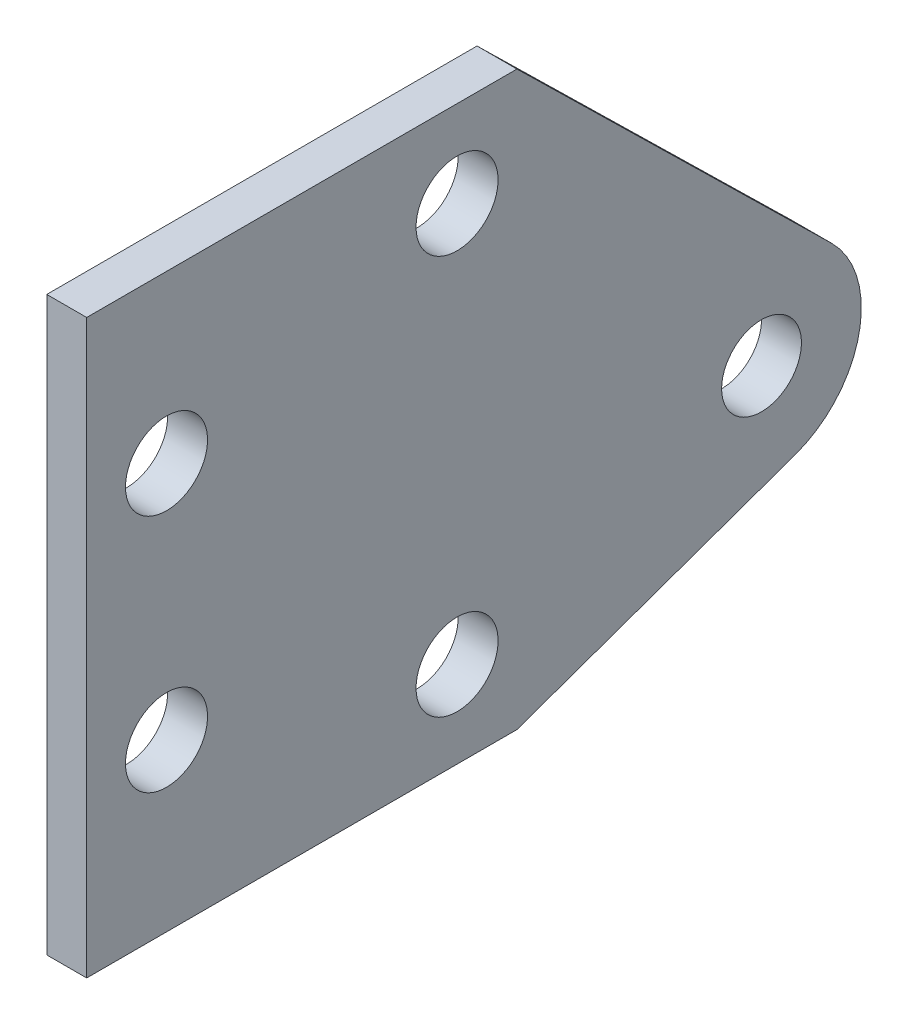
ISO-10303-21;
HEADER;
FILE_DESCRIPTION(('STEP AP214'),'2;1');
FILE_NAME('part.step','',(''),(''),'','','');
FILE_SCHEMA(('AUTOMOTIVE_DESIGN { 1 0 10303 214 1 1 1 1 }'));
ENDSEC;
DATA;
#1=APPLICATION_CONTEXT('core data for automotive mechanical design processes');
#2=APPLICATION_PROTOCOL_DEFINITION('international standard','automotive_design',2000,#1);
#3=PRODUCT_CONTEXT('',#1,'mechanical');
#4=PRODUCT('Part','Part','',(#3));
#5=PRODUCT_RELATED_PRODUCT_CATEGORY('part','',(#4));
#6=PRODUCT_DEFINITION_FORMATION('','',#4);
#7=PRODUCT_DEFINITION_CONTEXT('part definition',#1,'design');
#8=PRODUCT_DEFINITION('design','',#6,#7);
#9=PRODUCT_DEFINITION_SHAPE('','',#8);
#10=(LENGTH_UNIT() NAMED_UNIT(*) SI_UNIT(.MILLI.,.METRE.));
#11=(NAMED_UNIT(*) PLANE_ANGLE_UNIT() SI_UNIT($,.RADIAN.));
#12=(NAMED_UNIT(*) SI_UNIT($,.STERADIAN.) SOLID_ANGLE_UNIT());
#13=UNCERTAINTY_MEASURE_WITH_UNIT(LENGTH_MEASURE(1.E-05),#10,'distance_accuracy_value','');
#14=(GEOMETRIC_REPRESENTATION_CONTEXT(3) GLOBAL_UNCERTAINTY_ASSIGNED_CONTEXT((#13)) GLOBAL_UNIT_ASSIGNED_CONTEXT((#10,
#11,#12)) REPRESENTATION_CONTEXT('',''));
#15=CARTESIAN_POINT('',(0.,0.,0.));
#16=DIRECTION('',(0.,0.,1.));
#17=DIRECTION('',(1.,0.,0.));
#18=AXIS2_PLACEMENT_3D('',#15,#16,#17);
#19=CARTESIAN_POINT('',(-28.5750000000038,268.493082500583,95.4248000965209));
#20=DIRECTION('',(0.,0.942258335635861,0.334886889747475));
#21=DIRECTION('',(0.,-0.334886889747475,0.942258335635861));
#22=AXIS2_PLACEMENT_3D('',#19,#20,#21);
#23=PLANE('',#22);
#24=DIRECTION('',(0.,-0.334886889747475,0.942258335635861));
#25=VECTOR('',#24,1.);
#26=CARTESIAN_POINT('',(-25.4000000000038,268.493082500583,95.4248000965209));
#27=LINE('',#26,#25);
#28=CARTESIAN_POINT('',(-25.4000000000038,341.719008080164,-110.608164687619));
#29=VERTEX_POINT('',#28);
#30=CARTESIAN_POINT('',(-25.4000000000038,333.860683619272,-88.497500000243));
#31=VERTEX_POINT('',#30);
#32=EDGE_CURVE('E136',#29,#31,#27,.T.);
#33=ORIENTED_EDGE('',*,*,#32,.T.);
#34=DIRECTION('',(1.,0.,0.));
#35=VECTOR('',#34,1.);
#36=CARTESIAN_POINT('',(-28.5750000000038,333.860683619272,-88.497500000243));
#37=LINE('',#36,#35);
#38=CARTESIAN_POINT('',(-28.5750000000038,333.860683619272,-88.497500000243));
#39=VERTEX_POINT('',#38);
#40=EDGE_CURVE('E11',#39,#31,#37,.T.);
#41=ORIENTED_EDGE('',*,*,#40,.F.);
#42=DIRECTION('',(0.,-0.334886889747475,0.942258335635861));
#43=VECTOR('',#42,1.);
#44=CARTESIAN_POINT('',(-28.5750000000038,268.493082500583,95.4248000965209));
#45=LINE('',#44,#43);
#46=CARTESIAN_POINT('',(-28.5750000000038,341.719008080164,-110.608164687619));
#47=VERTEX_POINT('',#46);
#48=EDGE_CURVE('E161',#47,#39,#45,.T.);
#49=ORIENTED_EDGE('',*,*,#48,.F.);
#50=DIRECTION('',(1.,0.,0.));
#51=VECTOR('',#50,1.);
#52=CARTESIAN_POINT('',(-28.5750000000038,341.719008080164,-110.608164687619));
#53=LINE('',#52,#51);
#54=EDGE_CURVE('E135',#47,#29,#53,.T.);
#55=ORIENTED_EDGE('',*,*,#54,.T.);
#56=EDGE_LOOP('',(#33,#41,#49,#55));
#57=FACE_BOUND('',#56,.T.);
#58=ADVANCED_FACE('F36',(#57),#23,.F.);
#59=CARTESIAN_POINT('',(-28.5750000000038,333.860683619272,0.));
#60=DIRECTION('',(0.,1.,0.));
#61=DIRECTION('',(0.,0.,1.));
#62=AXIS2_PLACEMENT_3D('',#59,#60,#61);
#63=PLANE('',#62);
#64=DIRECTION('',(0.,0.,1.));
#65=VECTOR('',#64,1.);
#66=CARTESIAN_POINT('',(-25.4000000000038,333.860683619272,0.));
#67=LINE('',#66,#65);
#68=CARTESIAN_POINT('',(-25.4000000000038,333.860683619272,-54.2750000002463));
#69=VERTEX_POINT('',#68);
#70=EDGE_CURVE('E139',#31,#69,#67,.T.);
#71=ORIENTED_EDGE('',*,*,#70,.T.);
#72=DIRECTION('',(1.,0.,0.));
#73=VECTOR('',#72,1.);
#74=CARTESIAN_POINT('',(-28.5750000000038,333.860683619272,-54.2750000002463));
#75=LINE('',#74,#73);
#76=CARTESIAN_POINT('',(-28.5750000000038,333.860683619272,-54.2750000002463));
#77=VERTEX_POINT('',#76);
#78=EDGE_CURVE('E44',#77,#69,#75,.T.);
#79=ORIENTED_EDGE('',*,*,#78,.F.);
#80=DIRECTION('',(0.,0.,1.));
#81=VECTOR('',#80,1.);
#82=CARTESIAN_POINT('',(-28.5750000000038,333.860683619272,0.));
#83=LINE('',#82,#81);
#84=EDGE_CURVE('E89',#39,#77,#83,.T.);
#85=ORIENTED_EDGE('',*,*,#84,.F.);
#86=ORIENTED_EDGE('',*,*,#40,.T.);
#87=EDGE_LOOP('',(#71,#79,#85,#86));
#88=FACE_BOUND('',#87,.T.);
#89=ADVANCED_FACE('F191',(#88),#63,.F.);
#90=CARTESIAN_POINT('',(-28.5750000000038,5.6850044899975E-13,-54.2750000002498));
#91=DIRECTION('',(0.,0.,-1.));
#92=DIRECTION('',(0.,1.,0.));
#93=AXIS2_PLACEMENT_3D('',#90,#91,#92);
#94=PLANE('',#93);
#95=DIRECTION('',(0.,1.,0.));
#96=VECTOR('',#95,1.);
#97=CARTESIAN_POINT('',(-25.4000000000038,5.6850044899975E-13,-54.2750000002498));
#98=LINE('',#97,#96);
#99=CARTESIAN_POINT('',(-25.4000000000038,379.360683619273,-54.2750000002459));
#100=VERTEX_POINT('',#99);
#101=EDGE_CURVE('E141',#69,#100,#98,.T.);
#102=ORIENTED_EDGE('',*,*,#101,.T.);
#103=DIRECTION('',(1.,0.,0.));
#104=VECTOR('',#103,1.);
#105=CARTESIAN_POINT('',(-28.5750000000038,379.360683619273,-54.2750000002459));
#106=LINE('',#105,#104);
#107=CARTESIAN_POINT('',(-28.5750000000038,379.360683619273,-54.2750000002459));
#108=VERTEX_POINT('',#107);
#109=EDGE_CURVE('E112',#108,#100,#106,.T.);
#110=ORIENTED_EDGE('',*,*,#109,.F.);
#111=DIRECTION('',(0.,1.,0.));
#112=VECTOR('',#111,1.);
#113=CARTESIAN_POINT('',(-28.5750000000038,5.6850044899975E-13,-54.2750000002498));
#114=LINE('',#113,#112);
#115=EDGE_CURVE('E103',#77,#108,#114,.T.);
#116=ORIENTED_EDGE('',*,*,#115,.F.);
#117=ORIENTED_EDGE('',*,*,#78,.T.);
#118=EDGE_LOOP('',(#102,#110,#116,#117));
#119=FACE_BOUND('',#118,.T.);
#120=ADVANCED_FACE('F167',(#119),#94,.F.);
#121=CARTESIAN_POINT('',(-28.5750000000038,379.360683619272,4.1755525753253E-12));
#122=DIRECTION('',(0.,-1.,0.));
#123=DIRECTION('',(0.,0.,-1.));
#124=AXIS2_PLACEMENT_3D('',#121,#122,#123);
#125=PLANE('',#124);
#126=DIRECTION('',(0.,0.,-1.));
#127=VECTOR('',#126,1.);
#128=CARTESIAN_POINT('',(-25.4000000000038,379.360683619272,4.1755525753253E-12));
#129=LINE('',#128,#127);
#130=CARTESIAN_POINT('',(-25.4000000000038,379.360683619273,-88.4975000002426));
#131=VERTEX_POINT('',#130);
#132=EDGE_CURVE('E111',#100,#131,#129,.T.);
#133=ORIENTED_EDGE('',*,*,#132,.T.);
#134=DIRECTION('',(1.,0.,0.));
#135=VECTOR('',#134,1.);
#136=CARTESIAN_POINT('',(-28.5750000000038,379.360683619273,-88.4975000002426));
#137=LINE('',#136,#135);
#138=CARTESIAN_POINT('',(-28.5750000000038,379.360683619273,-88.4975000002426));
#139=VERTEX_POINT('',#138);
#140=EDGE_CURVE('E108',#139,#131,#137,.T.);
#141=ORIENTED_EDGE('',*,*,#140,.F.);
#142=DIRECTION('',(0.,0.,-1.));
#143=VECTOR('',#142,1.);
#144=CARTESIAN_POINT('',(-28.5750000000038,379.360683619272,4.1755525753253E-12));
#145=LINE('',#144,#143);
#146=EDGE_CURVE('E96',#108,#139,#145,.T.);
#147=ORIENTED_EDGE('',*,*,#146,.F.);
#148=ORIENTED_EDGE('',*,*,#109,.T.);
#149=EDGE_LOOP('',(#133,#141,#147,#148));
#150=FACE_BOUND('',#149,.T.);
#151=ADVANCED_FACE('F109',(#150),#125,.F.);
#152=CARTESIAN_POINT('',(-28.5750000000038,237.863920821237,-232.967924063665));
#153=DIRECTION('',(0.,-0.714421084351475,0.699716023994065));
#154=DIRECTION('',(0.,-0.699716023994065,-0.714421084351475));
#155=AXIS2_PLACEMENT_3D('',#152,#153,#154);
#156=PLANE('',#155);
#157=DIRECTION('',(0.,-0.699716023994065,-0.714421084351475));
#158=VECTOR('',#157,1.);
#159=CARTESIAN_POINT('',(-25.4000000000038,237.863920821237,-232.967924063665));
#160=LINE('',#159,#158);
#161=CARTESIAN_POINT('',(-25.4000000000038,354.868900976314,-113.503995940701));
#162=VERTEX_POINT('',#161);
#163=EDGE_CURVE('E75',#131,#162,#160,.T.);
#164=ORIENTED_EDGE('',*,*,#163,.T.);
#165=DIRECTION('',(1.,0.,0.));
#166=VECTOR('',#165,1.);
#167=CARTESIAN_POINT('',(-28.5750000000038,354.868900976314,-113.503995940701));
#168=LINE('',#167,#166);
#169=CARTESIAN_POINT('',(-28.5750000000038,354.868900976314,-113.503995940701));
#170=VERTEX_POINT('',#169);
#171=EDGE_CURVE('E113',#170,#162,#168,.T.);
#172=ORIENTED_EDGE('',*,*,#171,.F.);
#173=DIRECTION('',(0.,-0.699716023994065,-0.714421084351475));
#174=VECTOR('',#173,1.);
#175=CARTESIAN_POINT('',(-28.5750000000038,237.863920821237,-232.967924063665));
#176=LINE('',#175,#174);
#177=EDGE_CURVE('E101',#139,#170,#176,.T.);
#178=ORIENTED_EDGE('',*,*,#177,.F.);
#179=ORIENTED_EDGE('',*,*,#140,.T.);
#180=EDGE_LOOP('',(#164,#172,#178,#179));
#181=FACE_BOUND('',#180,.T.);
#182=ADVANCED_FACE('F115',(#181),#156,.F.);
#183=CARTESIAN_POINT('',(-28.5750000000038,372.485683619273,-83.7350000002471));
#184=DIRECTION('',(1.,0.,0.));
#185=DIRECTION('',(0.,0.,-1.));
#186=AXIS2_PLACEMENT_3D('',#183,#184,#185);
#187=CYLINDRICAL_SURFACE('',#186,3.26390000015049);
#188=CARTESIAN_POINT('',(-28.5750000000038,372.485683619273,-83.7350000002471));
#189=DIRECTION('',(-1.,0.,0.));
#190=DIRECTION('',(0.,0.,1.));
#191=AXIS2_PLACEMENT_3D('',#188,#189,#190);
#192=CIRCLE('',#191,3.26390000015049);
#193=CARTESIAN_POINT('',(-28.5750000000038,372.485683619273,-80.4711000000966));
#194=VERTEX_POINT('',#193);
#195=EDGE_CURVE('E129',#194,#194,#192,.F.);
#196=ORIENTED_EDGE('',*,*,#195,.F.);
#197=EDGE_LOOP('',(#196));
#198=FACE_BOUND('',#197,.T.);
#199=CARTESIAN_POINT('',(-25.4000000000038,372.485683619273,-83.7350000002471));
#200=DIRECTION('',(-1.,0.,0.));
#201=DIRECTION('',(0.,0.,1.));
#202=AXIS2_PLACEMENT_3D('',#199,#200,#201);
#203=CIRCLE('',#202,3.26390000015049);
#204=CARTESIAN_POINT('',(-25.4000000000038,372.485683619273,-80.4711000000966));
#205=VERTEX_POINT('',#204);
#206=EDGE_CURVE('E155',#205,#205,#203,.F.);
#207=ORIENTED_EDGE('',*,*,#206,.T.);
#208=EDGE_LOOP('',(#207));
#209=FACE_BOUND('',#208,.T.);
#210=ADVANCED_FACE('F202',(#198,#209),#187,.F.);
#211=CARTESIAN_POINT('',(-28.5750000000038,366.135683619273,-60.6250000002459));
#212=DIRECTION('',(1.,0.,0.));
#213=DIRECTION('',(0.,0.,-1.));
#214=AXIS2_PLACEMENT_3D('',#211,#212,#213);
#215=CYLINDRICAL_SURFACE('',#214,3.26390000000004);
#216=CARTESIAN_POINT('',(-28.5750000000038,366.135683619273,-60.6250000002459));
#217=DIRECTION('',(-1.,0.,0.));
#218=DIRECTION('',(0.,0.,1.));
#219=AXIS2_PLACEMENT_3D('',#216,#217,#218);
#220=CIRCLE('',#219,3.26390000000004);
#221=CARTESIAN_POINT('',(-28.5750000000038,366.135683619273,-57.3611000002458));
#222=VERTEX_POINT('',#221);
#223=EDGE_CURVE('E126',#222,#222,#220,.F.);
#224=ORIENTED_EDGE('',*,*,#223,.F.);
#225=EDGE_LOOP('',(#224));
#226=FACE_BOUND('',#225,.T.);
#227=CARTESIAN_POINT('',(-25.4000000000038,366.135683619273,-60.6250000002459));
#228=DIRECTION('',(-1.,0.,0.));
#229=DIRECTION('',(0.,0.,1.));
#230=AXIS2_PLACEMENT_3D('',#227,#228,#229);
#231=CIRCLE('',#230,3.26390000000004);
#232=CARTESIAN_POINT('',(-25.4000000000038,366.135683619273,-57.3611000002458));
#233=VERTEX_POINT('',#232);
#234=EDGE_CURVE('E152',#233,#233,#231,.F.);
#235=ORIENTED_EDGE('',*,*,#234,.T.);
#236=EDGE_LOOP('',(#235));
#237=FACE_BOUND('',#236,.T.);
#238=ADVANCED_FACE('F206',(#226,#237),#215,.F.);
#239=CARTESIAN_POINT('',(-28.5750000000038,340.735683619273,-83.7350000002471));
#240=DIRECTION('',(1.,0.,0.));
#241=DIRECTION('',(0.,0.,-1.));
#242=AXIS2_PLACEMENT_3D('',#239,#240,#241);
#243=CYLINDRICAL_SURFACE('',#242,3.26390000015049);
#244=CARTESIAN_POINT('',(-28.5750000000038,340.735683619273,-83.7350000002471));
#245=DIRECTION('',(-1.,0.,0.));
#246=DIRECTION('',(0.,0.,1.));
#247=AXIS2_PLACEMENT_3D('',#244,#245,#246);
#248=CIRCLE('',#247,3.26390000015049);
#249=CARTESIAN_POINT('',(-28.5750000000038,340.735683619273,-80.4711000000966));
#250=VERTEX_POINT('',#249);
#251=EDGE_CURVE('E123',#250,#250,#248,.F.);
#252=ORIENTED_EDGE('',*,*,#251,.F.);
#253=EDGE_LOOP('',(#252));
#254=FACE_BOUND('',#253,.T.);
#255=CARTESIAN_POINT('',(-25.4000000000038,340.735683619273,-83.7350000002471));
#256=DIRECTION('',(-1.,0.,0.));
#257=DIRECTION('',(0.,0.,1.));
#258=AXIS2_PLACEMENT_3D('',#255,#256,#257);
#259=CIRCLE('',#258,3.26390000015049);
#260=CARTESIAN_POINT('',(-25.4000000000038,340.735683619273,-80.4711000000966));
#261=VERTEX_POINT('',#260);
#262=EDGE_CURVE('E149',#261,#261,#259,.F.);
#263=ORIENTED_EDGE('',*,*,#262,.T.);
#264=EDGE_LOOP('',(#263));
#265=FACE_BOUND('',#264,.T.);
#266=ADVANCED_FACE('F186',(#254,#265),#243,.F.);
#267=CARTESIAN_POINT('',(-28.5750000000038,349.198183619274,-107.950000000248));
#268=DIRECTION('',(1.,0.,0.));
#269=DIRECTION('',(0.,0.,-1.));
#270=AXIS2_PLACEMENT_3D('',#267,#268,#269);
#271=CYLINDRICAL_SURFACE('',#270,3.175);
#272=CARTESIAN_POINT('',(-28.5750000000038,349.198183619274,-107.950000000248));
#273=DIRECTION('',(-1.,0.,0.));
#274=DIRECTION('',(0.,0.,1.));
#275=AXIS2_PLACEMENT_3D('',#272,#273,#274);
#276=CIRCLE('',#275,3.175);
#277=CARTESIAN_POINT('',(-28.5750000000038,349.198183619274,-104.775000000248));
#278=VERTEX_POINT('',#277);
#279=EDGE_CURVE('E117',#278,#278,#276,.T.);
#280=ORIENTED_EDGE('',*,*,#279,.T.);
#281=EDGE_LOOP('',(#280));
#282=FACE_BOUND('',#281,.T.);
#283=CARTESIAN_POINT('',(-25.4000000000038,349.198183619274,-107.950000000248));
#284=DIRECTION('',(-1.,0.,0.));
#285=DIRECTION('',(0.,0.,1.));
#286=AXIS2_PLACEMENT_3D('',#283,#284,#285);
#287=CIRCLE('',#286,3.175);
#288=CARTESIAN_POINT('',(-25.4000000000038,349.198183619274,-104.775000000248));
#289=VERTEX_POINT('',#288);
#290=EDGE_CURVE('E146',#289,#289,#287,.T.);
#291=ORIENTED_EDGE('',*,*,#290,.F.);
#292=EDGE_LOOP('',(#291));
#293=FACE_BOUND('',#292,.T.);
#294=ADVANCED_FACE('F178',(#282,#293),#271,.F.);
#295=CARTESIAN_POINT('',(-28.5750000000038,349.198183619274,-107.950000000248));
#296=DIRECTION('',(1.,0.,0.));
#297=DIRECTION('',(0.,0.,-1.));
#298=AXIS2_PLACEMENT_3D('',#295,#296,#297);
#299=CYLINDRICAL_SURFACE('',#298,7.9375);
#300=CARTESIAN_POINT('',(-25.4000000000038,349.198183619274,-107.950000000248));
#301=DIRECTION('',(-1.,0.,0.));
#302=DIRECTION('',(0.,0.,1.));
#303=AXIS2_PLACEMENT_3D('',#300,#301,#302);
#304=CIRCLE('',#303,7.9375);
#305=EDGE_CURVE('E81',#162,#29,#304,.T.);
#306=ORIENTED_EDGE('',*,*,#305,.T.);
#307=ORIENTED_EDGE('',*,*,#54,.F.);
#308=CARTESIAN_POINT('',(-28.5750000000038,349.198183619274,-107.950000000248));
#309=DIRECTION('',(-1.,0.,0.));
#310=DIRECTION('',(0.,0.,1.));
#311=AXIS2_PLACEMENT_3D('',#308,#309,#310);
#312=CIRCLE('',#311,7.9375);
#313=EDGE_CURVE('E52',#170,#47,#312,.T.);
#314=ORIENTED_EDGE('',*,*,#313,.F.);
#315=ORIENTED_EDGE('',*,*,#171,.T.);
#316=EDGE_LOOP('',(#306,#307,#314,#315));
#317=FACE_BOUND('',#316,.T.);
#318=ADVANCED_FACE('F175',(#317),#299,.T.);
#319=CARTESIAN_POINT('',(-28.5750000000038,347.085683619273,-60.6250000002459));
#320=DIRECTION('',(1.,0.,0.));
#321=DIRECTION('',(0.,0.,-1.));
#322=AXIS2_PLACEMENT_3D('',#319,#320,#321);
#323=CYLINDRICAL_SURFACE('',#322,3.26390000000003);
#324=CARTESIAN_POINT('',(-28.5750000000038,347.085683619273,-60.6250000002459));
#325=DIRECTION('',(-1.,0.,0.));
#326=DIRECTION('',(0.,0.,1.));
#327=AXIS2_PLACEMENT_3D('',#324,#325,#326);
#328=CIRCLE('',#327,3.26390000000003);
#329=CARTESIAN_POINT('',(-28.5750000000038,347.085683619273,-57.3611000002458));
#330=VERTEX_POINT('',#329);
#331=EDGE_CURVE('E132',#330,#330,#328,.F.);
#332=ORIENTED_EDGE('',*,*,#331,.F.);
#333=EDGE_LOOP('',(#332));
#334=FACE_BOUND('',#333,.T.);
#335=CARTESIAN_POINT('',(-25.4000000000038,347.085683619273,-60.6250000002459));
#336=DIRECTION('',(-1.,0.,0.));
#337=DIRECTION('',(0.,0.,1.));
#338=AXIS2_PLACEMENT_3D('',#335,#336,#337);
#339=CIRCLE('',#338,3.26390000000003);
#340=CARTESIAN_POINT('',(-25.4000000000038,347.085683619273,-57.3611000002458));
#341=VERTEX_POINT('',#340);
#342=EDGE_CURVE('E158',#341,#341,#339,.F.);
#343=ORIENTED_EDGE('',*,*,#342,.T.);
#344=EDGE_LOOP('',(#343));
#345=FACE_BOUND('',#344,.T.);
#346=ADVANCED_FACE('F177',(#334,#345),#323,.F.);
#347=CARTESIAN_POINT('',(-28.5750000000038,0.,0.));
#348=DIRECTION('',(-1.,0.,0.));
#349=DIRECTION('',(0.,0.,1.));
#350=AXIS2_PLACEMENT_3D('',#347,#348,#349);
#351=PLANE('',#350);
#352=ORIENTED_EDGE('',*,*,#48,.T.);
#353=ORIENTED_EDGE('',*,*,#84,.T.);
#354=ORIENTED_EDGE('',*,*,#115,.T.);
#355=ORIENTED_EDGE('',*,*,#146,.T.);
#356=ORIENTED_EDGE('',*,*,#177,.T.);
#357=ORIENTED_EDGE('',*,*,#313,.T.);
#358=EDGE_LOOP('',(#352,#353,#354,#355,#356,#357));
#359=FACE_BOUND('',#358,.T.);
#360=ORIENTED_EDGE('',*,*,#279,.F.);
#361=EDGE_LOOP('',(#360));
#362=FACE_BOUND('',#361,.T.);
#363=ORIENTED_EDGE('',*,*,#251,.T.);
#364=EDGE_LOOP('',(#363));
#365=FACE_BOUND('',#364,.T.);
#366=ORIENTED_EDGE('',*,*,#223,.T.);
#367=EDGE_LOOP('',(#366));
#368=FACE_BOUND('',#367,.T.);
#369=ORIENTED_EDGE('',*,*,#195,.T.);
#370=EDGE_LOOP('',(#369));
#371=FACE_BOUND('',#370,.T.);
#372=ORIENTED_EDGE('',*,*,#331,.T.);
#373=EDGE_LOOP('',(#372));
#374=FACE_BOUND('',#373,.T.);
#375=ADVANCED_FACE('F98',(#359,#362,#365,#368,#371,#374),#351,.T.);
#376=CARTESIAN_POINT('',(-25.4000000000038,0.,0.));
#377=DIRECTION('',(-1.,0.,0.));
#378=DIRECTION('',(0.,0.,1.));
#379=AXIS2_PLACEMENT_3D('',#376,#377,#378);
#380=PLANE('',#379);
#381=ORIENTED_EDGE('',*,*,#32,.F.);
#382=ORIENTED_EDGE('',*,*,#305,.F.);
#383=ORIENTED_EDGE('',*,*,#163,.F.);
#384=ORIENTED_EDGE('',*,*,#132,.F.);
#385=ORIENTED_EDGE('',*,*,#101,.F.);
#386=ORIENTED_EDGE('',*,*,#70,.F.);
#387=EDGE_LOOP('',(#381,#382,#383,#384,#385,#386));
#388=FACE_BOUND('',#387,.T.);
#389=ORIENTED_EDGE('',*,*,#290,.T.);
#390=EDGE_LOOP('',(#389));
#391=FACE_BOUND('',#390,.T.);
#392=ORIENTED_EDGE('',*,*,#262,.F.);
#393=EDGE_LOOP('',(#392));
#394=FACE_BOUND('',#393,.T.);
#395=ORIENTED_EDGE('',*,*,#234,.F.);
#396=EDGE_LOOP('',(#395));
#397=FACE_BOUND('',#396,.T.);
#398=ORIENTED_EDGE('',*,*,#206,.F.);
#399=EDGE_LOOP('',(#398));
#400=FACE_BOUND('',#399,.T.);
#401=ORIENTED_EDGE('',*,*,#342,.F.);
#402=EDGE_LOOP('',(#401));
#403=FACE_BOUND('',#402,.T.);
#404=ADVANCED_FACE('F170',(#388,#391,#394,#397,#400,#403),#380,.F.);
#405=CLOSED_SHELL('',(#58,#89,#120,#151,#182,#210,#238,#266,#294,#318,#346,#375,#404));
#406=MANIFOLD_SOLID_BREP('B2',#405);
#407=ADVANCED_BREP_SHAPE_REPRESENTATION('',(#18,#406),#14);
#408=SHAPE_DEFINITION_REPRESENTATION(#9,#407);
ENDSEC;
END-ISO-10303-21;
